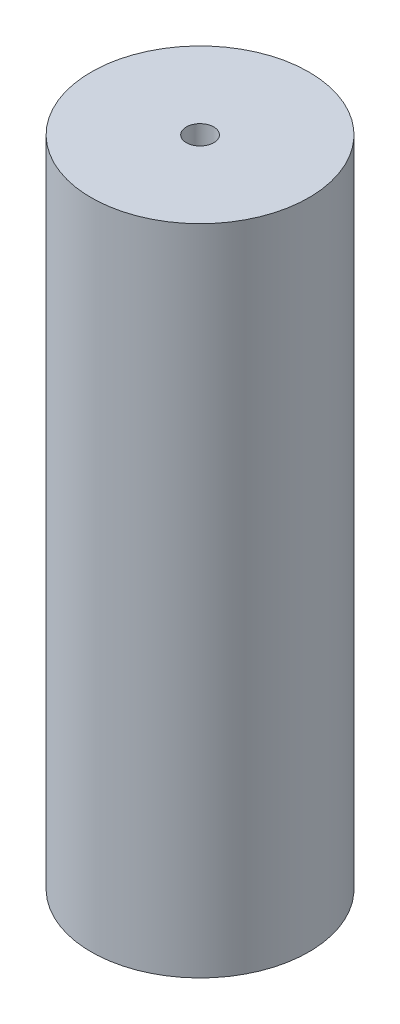
ISO-10303-21;
HEADER;
FILE_DESCRIPTION(('STEP AP214'),'2;1');
FILE_NAME('part.step','',(''),(''),'','','');
FILE_SCHEMA(('AUTOMOTIVE_DESIGN { 1 0 10303 214 1 1 1 1 }'));
ENDSEC;
DATA;
#1=APPLICATION_CONTEXT('core data for automotive mechanical design processes');
#2=APPLICATION_PROTOCOL_DEFINITION('international standard','automotive_design',2000,#1);
#3=PRODUCT_CONTEXT('',#1,'mechanical');
#4=PRODUCT('Part','Part','',(#3));
#5=PRODUCT_RELATED_PRODUCT_CATEGORY('part','',(#4));
#6=PRODUCT_DEFINITION_FORMATION('','',#4);
#7=PRODUCT_DEFINITION_CONTEXT('part definition',#1,'design');
#8=PRODUCT_DEFINITION('design','',#6,#7);
#9=PRODUCT_DEFINITION_SHAPE('','',#8);
#10=(LENGTH_UNIT() NAMED_UNIT(*) SI_UNIT(.MILLI.,.METRE.));
#11=(NAMED_UNIT(*) PLANE_ANGLE_UNIT() SI_UNIT($,.RADIAN.));
#12=(NAMED_UNIT(*) SI_UNIT($,.STERADIAN.) SOLID_ANGLE_UNIT());
#13=UNCERTAINTY_MEASURE_WITH_UNIT(LENGTH_MEASURE(1.E-05),#10,'distance_accuracy_value','');
#14=(GEOMETRIC_REPRESENTATION_CONTEXT(3) GLOBAL_UNCERTAINTY_ASSIGNED_CONTEXT((#13)) GLOBAL_UNIT_ASSIGNED_CONTEXT((#10,
#11,#12)) REPRESENTATION_CONTEXT('',''));
#15=CARTESIAN_POINT('',(0.,0.,0.));
#16=DIRECTION('',(0.,0.,1.));
#17=DIRECTION('',(1.,0.,0.));
#18=AXIS2_PLACEMENT_3D('',#15,#16,#17);
#19=CARTESIAN_POINT('',(0.,38.1,0.));
#20=DIRECTION('',(0.,-1.,0.));
#21=DIRECTION('',(0.,0.,-1.));
#22=AXIS2_PLACEMENT_3D('',#19,#20,#21);
#23=CYLINDRICAL_SURFACE('',#22,6.35);
#24=CARTESIAN_POINT('',(0.,38.1,0.));
#25=DIRECTION('',(0.,1.,0.));
#26=DIRECTION('',(0.,0.,1.));
#27=AXIS2_PLACEMENT_3D('',#24,#25,#26);
#28=CIRCLE('',#27,6.35);
#29=CARTESIAN_POINT('',(0.,38.1,-6.35));
#30=VERTEX_POINT('',#29);
#31=EDGE_CURVE('E11',#30,#30,#28,.T.);
#32=CARTESIAN_POINT('',(0.,0.,0.));
#33=DIRECTION('',(0.,1.,0.));
#34=DIRECTION('',(0.,0.,1.));
#35=AXIS2_PLACEMENT_3D('',#32,#33,#34);
#36=CIRCLE('',#35,6.35);
#37=CARTESIAN_POINT('',(0.,0.,-6.35));
#38=VERTEX_POINT('',#37);
#39=EDGE_CURVE('E48',#38,#38,#36,.T.);
#40=CARTESIAN_POINT('',(0.,38.1,-6.35));
#41=CARTESIAN_POINT('',(0.,37.703125,-6.35));
#42=CARTESIAN_POINT('',(0.,37.30625,-6.35));
#43=CARTESIAN_POINT('',(0.,36.5125,-6.35));
#44=CARTESIAN_POINT('',(0.,36.115625,-6.35));
#45=CARTESIAN_POINT('',(0.,35.321875,-6.35));
#46=CARTESIAN_POINT('',(0.,34.925,-6.35));
#47=CARTESIAN_POINT('',(0.,34.13125,-6.35));
#48=CARTESIAN_POINT('',(0.,33.734375,-6.35));
#49=CARTESIAN_POINT('',(0.,32.940625,-6.35));
#50=CARTESIAN_POINT('',(0.,32.54375,-6.35));
#51=CARTESIAN_POINT('',(0.,31.75,-6.35));
#52=CARTESIAN_POINT('',(0.,31.353125,-6.35));
#53=CARTESIAN_POINT('',(0.,30.559375,-6.35));
#54=CARTESIAN_POINT('',(0.,30.1625,-6.35));
#55=CARTESIAN_POINT('',(0.,29.36875,-6.35));
#56=CARTESIAN_POINT('',(0.,28.971875,-6.35));
#57=CARTESIAN_POINT('',(0.,28.178125,-6.35));
#58=CARTESIAN_POINT('',(0.,27.78125,-6.35));
#59=CARTESIAN_POINT('',(0.,26.9875,-6.35));
#60=CARTESIAN_POINT('',(0.,26.590625,-6.35));
#61=CARTESIAN_POINT('',(0.,25.796875,-6.35));
#62=CARTESIAN_POINT('',(0.,25.4,-6.35));
#63=CARTESIAN_POINT('',(0.,24.60625,-6.35));
#64=CARTESIAN_POINT('',(0.,24.209375,-6.35));
#65=CARTESIAN_POINT('',(0.,23.415625,-6.35));
#66=CARTESIAN_POINT('',(0.,23.01875,-6.35));
#67=CARTESIAN_POINT('',(0.,22.225,-6.35));
#68=CARTESIAN_POINT('',(0.,21.828125,-6.35));
#69=CARTESIAN_POINT('',(0.,21.034375,-6.35));
#70=CARTESIAN_POINT('',(0.,20.6375,-6.35));
#71=CARTESIAN_POINT('',(0.,19.84375,-6.35));
#72=CARTESIAN_POINT('',(0.,19.446875,-6.35));
#73=CARTESIAN_POINT('',(0.,18.653125,-6.35));
#74=CARTESIAN_POINT('',(0.,18.25625,-6.35));
#75=CARTESIAN_POINT('',(0.,17.4625,-6.35));
#76=CARTESIAN_POINT('',(0.,17.065625,-6.35));
#77=CARTESIAN_POINT('',(0.,16.271875,-6.35));
#78=CARTESIAN_POINT('',(0.,15.875,-6.35));
#79=CARTESIAN_POINT('',(0.,15.08125,-6.35));
#80=CARTESIAN_POINT('',(0.,14.684375,-6.35));
#81=CARTESIAN_POINT('',(0.,13.890625,-6.35));
#82=CARTESIAN_POINT('',(0.,13.49375,-6.35));
#83=CARTESIAN_POINT('',(0.,12.7,-6.35));
#84=CARTESIAN_POINT('',(0.,12.303125,-6.35));
#85=CARTESIAN_POINT('',(0.,11.509375,-6.35));
#86=CARTESIAN_POINT('',(0.,11.1125,-6.35));
#87=CARTESIAN_POINT('',(0.,10.31875,-6.35));
#88=CARTESIAN_POINT('',(0.,9.921875,-6.35));
#89=CARTESIAN_POINT('',(0.,9.128125,-6.35));
#90=CARTESIAN_POINT('',(0.,8.73125,-6.35));
#91=CARTESIAN_POINT('',(0.,7.9375,-6.35));
#92=CARTESIAN_POINT('',(0.,7.540625,-6.35));
#93=CARTESIAN_POINT('',(0.,6.746875,-6.35));
#94=CARTESIAN_POINT('',(0.,6.35,-6.35));
#95=CARTESIAN_POINT('',(0.,5.55625,-6.35));
#96=CARTESIAN_POINT('',(0.,5.159375,-6.35));
#97=CARTESIAN_POINT('',(0.,4.365625,-6.35));
#98=CARTESIAN_POINT('',(0.,3.96875,-6.35));
#99=CARTESIAN_POINT('',(0.,3.175,-6.35));
#100=CARTESIAN_POINT('',(0.,2.778125,-6.35));
#101=CARTESIAN_POINT('',(0.,1.984375,-6.35));
#102=CARTESIAN_POINT('',(0.,1.5875,-6.35));
#103=CARTESIAN_POINT('',(0.,0.79375,-6.35));
#104=CARTESIAN_POINT('',(0.,0.396875,-6.35));
#105=CARTESIAN_POINT('',(0.,0.,-6.35));
#106=B_SPLINE_CURVE_WITH_KNOTS('',3,(#40,#41,#42,#43,#44,#45,#46,#47,#48,#49,#50,#51,#52,#53,
#54,#55,#56,#57,#58,#59,#60,#61,#62,#63,#64,#65,#66,#67,#68,#69,#70,#71,#72,#73,#74,#75,#76,#77,
#78,#79,#80,#81,#82,#83,#84,#85,#86,#87,#88,#89,#90,#91,#92,#93,#94,#95,#96,#97,#98,#99,#100,
#101,#102,#103,#104,#105),.UNSPECIFIED.,.F.,.F.,(4,2,2,2,2,2,2,2,2,2,2,2,2,2,2,2,2,2,2,2,2,2,2,
2,2,2,2,2,2,2,2,2,4),(0.,1.19062499999999,2.38124999999999,3.571875,4.7625,5.953125,7.14375,
8.33437499999999,9.525,10.715625,11.90625,13.096875,14.2875,15.478125,16.66875,17.859375,19.05,
20.240625,21.43125,22.621875,23.8125,25.003125,26.19375,27.384375,28.575,29.765625,30.95625,
32.146875,33.3375,34.528125,35.71875,36.909375,38.1),.UNSPECIFIED.);
#107=EDGE_CURVE('BSEAM45',#30,#38,#106,.T.);
#108=ORIENTED_EDGE('',*,*,#31,.F.);
#109=ORIENTED_EDGE('',*,*,#39,.T.);
#110=ORIENTED_EDGE('',*,*,#107,.T.);
#111=ORIENTED_EDGE('',*,*,#107,.F.);
#112=EDGE_LOOP('',(#108,#110,#109,#111));
#113=FACE_BOUND('',#112,.T.);
#114=ADVANCED_FACE('F45',(#113),#23,.T.);
#115=CARTESIAN_POINT('',(0.,38.1,0.));
#116=DIRECTION('',(0.,1.,0.));
#117=DIRECTION('',(0.,0.,1.));
#118=AXIS2_PLACEMENT_3D('',#115,#116,#117);
#119=PLANE('',#118);
#120=CARTESIAN_POINT('',(0.,38.1,0.));
#121=DIRECTION('',(0.,1.,0.));
#122=DIRECTION('',(0.,0.,1.));
#123=AXIS2_PLACEMENT_3D('',#120,#121,#122);
#124=CIRCLE('',#123,0.79999999999999);
#125=CARTESIAN_POINT('',(0.,38.1,0.79999999999999));
#126=VERTEX_POINT('',#125);
#127=EDGE_CURVE('E66',#126,#126,#124,.T.);
#128=ORIENTED_EDGE('',*,*,#127,.F.);
#129=EDGE_LOOP('',(#128));
#130=FACE_BOUND('',#129,.T.);
#131=ORIENTED_EDGE('',*,*,#31,.T.);
#132=EDGE_LOOP('',(#131));
#133=FACE_BOUND('',#132,.T.);
#134=ADVANCED_FACE('F76',(#130,#133),#119,.T.);
#135=CARTESIAN_POINT('',(0.,0.,0.));
#136=DIRECTION('',(0.,1.,0.));
#137=DIRECTION('',(0.,0.,1.));
#138=AXIS2_PLACEMENT_3D('',#135,#136,#137);
#139=PLANE('',#138);
#140=ORIENTED_EDGE('',*,*,#39,.F.);
#141=EDGE_LOOP('',(#140));
#142=FACE_BOUND('',#141,.T.);
#143=ADVANCED_FACE('F59',(#142),#139,.F.);
#144=CARTESIAN_POINT('',(0.,36.068,0.));
#145=DIRECTION('',(0.,1.,0.));
#146=DIRECTION('',(0.,0.,1.));
#147=AXIS2_PLACEMENT_3D('',#144,#145,#146);
#148=CONICAL_SURFACE('',#147,0.799999999999999,1.02974425867665);
#149=CARTESIAN_POINT('',(0.,35.587311504778,0.));
#150=VERTEX_POINT('',#149);
#151=VERTEX_LOOP('',#150);
#152=FACE_BOUND('',#151,.T.);
#153=CARTESIAN_POINT('',(0.,36.068,0.));
#154=DIRECTION('',(0.,1.,0.));
#155=DIRECTION('',(0.,0.,1.));
#156=AXIS2_PLACEMENT_3D('',#153,#154,#155);
#157=CIRCLE('',#156,0.799999999999999);
#158=CARTESIAN_POINT('',(0.,36.068,0.799999999999999));
#159=VERTEX_POINT('',#158);
#160=EDGE_CURVE('E63',#159,#159,#157,.T.);
#161=ORIENTED_EDGE('',*,*,#160,.T.);
#162=EDGE_LOOP('',(#161));
#163=FACE_BOUND('',#162,.T.);
#164=ADVANCED_FACE('F55',(#152,#163),#148,.F.);
#165=CARTESIAN_POINT('',(0.,38.1,0.));
#166=DIRECTION('',(0.,1.,0.));
#167=DIRECTION('',(0.,0.,1.));
#168=AXIS2_PLACEMENT_3D('',#165,#166,#167);
#169=CYLINDRICAL_SURFACE('',#168,0.799999999999995);
#170=ORIENTED_EDGE('',*,*,#160,.F.);
#171=EDGE_LOOP('',(#170));
#172=FACE_BOUND('',#171,.T.);
#173=ORIENTED_EDGE('',*,*,#127,.T.);
#174=EDGE_LOOP('',(#173));
#175=FACE_BOUND('',#174,.T.);
#176=ADVANCED_FACE('F58',(#172,#175),#169,.F.);
#177=CLOSED_SHELL('',(#114,#134,#143,#164,#176));
#178=MANIFOLD_SOLID_BREP('B2',#177);
#179=ADVANCED_BREP_SHAPE_REPRESENTATION('',(#18,#178),#14);
#180=SHAPE_DEFINITION_REPRESENTATION(#9,#179);
ENDSEC;
END-ISO-10303-21;
